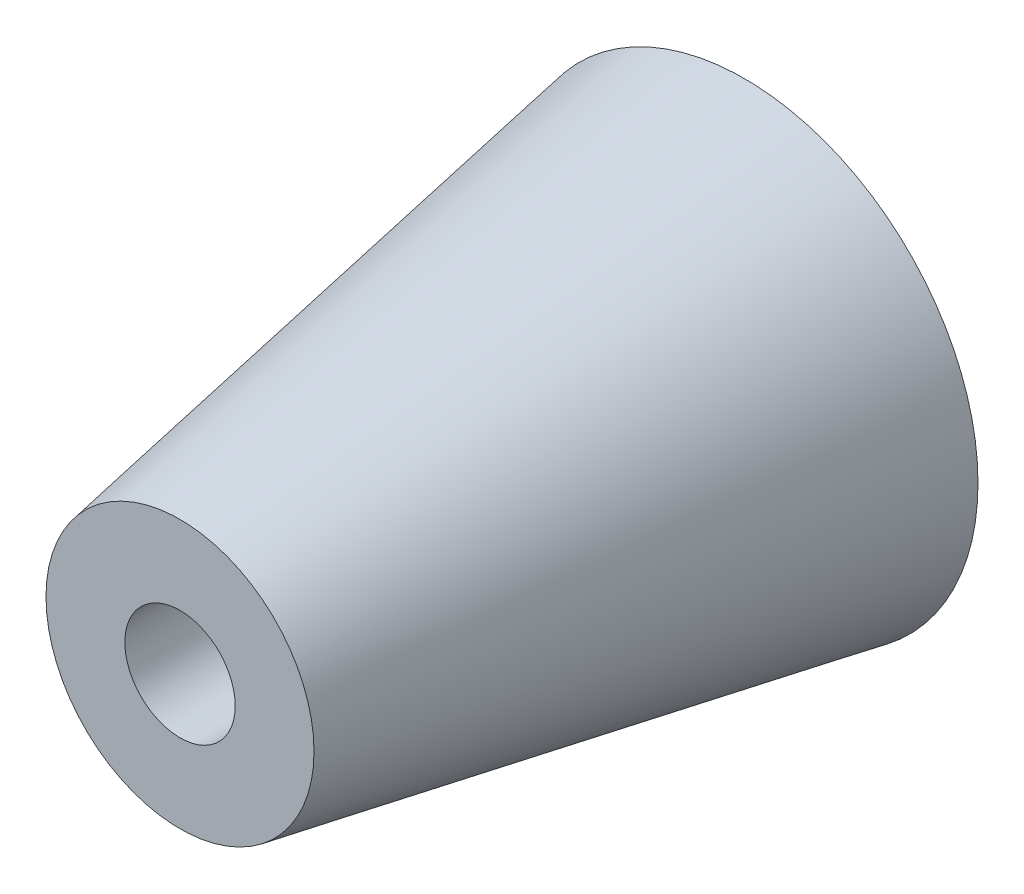
ISO-10303-21;
HEADER;
FILE_DESCRIPTION(('STEP AP214'),'2;1');
FILE_NAME('part.step','',(''),(''),'','','');
FILE_SCHEMA(('AUTOMOTIVE_DESIGN { 1 0 10303 214 1 1 1 1 }'));
ENDSEC;
DATA;
#1=APPLICATION_CONTEXT('core data for automotive mechanical design processes');
#2=APPLICATION_PROTOCOL_DEFINITION('international standard','automotive_design',2000,#1);
#3=PRODUCT_CONTEXT('',#1,'mechanical');
#4=PRODUCT('Part','Part','',(#3));
#5=PRODUCT_RELATED_PRODUCT_CATEGORY('part','',(#4));
#6=PRODUCT_DEFINITION_FORMATION('','',#4);
#7=PRODUCT_DEFINITION_CONTEXT('part definition',#1,'design');
#8=PRODUCT_DEFINITION('design','',#6,#7);
#9=PRODUCT_DEFINITION_SHAPE('','',#8);
#10=(LENGTH_UNIT() NAMED_UNIT(*) SI_UNIT(.MILLI.,.METRE.));
#11=(NAMED_UNIT(*) PLANE_ANGLE_UNIT() SI_UNIT($,.RADIAN.));
#12=(NAMED_UNIT(*) SI_UNIT($,.STERADIAN.) SOLID_ANGLE_UNIT());
#13=UNCERTAINTY_MEASURE_WITH_UNIT(LENGTH_MEASURE(1.E-05),#10,'distance_accuracy_value','');
#14=(GEOMETRIC_REPRESENTATION_CONTEXT(3) GLOBAL_UNCERTAINTY_ASSIGNED_CONTEXT((#13)) GLOBAL_UNIT_ASSIGNED_CONTEXT((#10,
#11,#12)) REPRESENTATION_CONTEXT('',''));
#15=CARTESIAN_POINT('',(0.,0.,0.));
#16=DIRECTION('',(0.,0.,1.));
#17=DIRECTION('',(1.,0.,0.));
#18=AXIS2_PLACEMENT_3D('',#15,#16,#17);
#19=CARTESIAN_POINT('',(0.,8.5,33.7153604632454));
#20=DIRECTION('',(0.,0.,-1.));
#21=DIRECTION('',(-1.,0.,0.));
#22=AXIS2_PLACEMENT_3D('',#19,#20,#21);
#23=PLANE('',#22);
#24=CARTESIAN_POINT('',(0.,0.,33.7153604632454));
#25=DIRECTION('',(0.,0.,1.));
#26=DIRECTION('',(1.,0.,0.));
#27=AXIS2_PLACEMENT_3D('',#24,#25,#26);
#28=CIRCLE('',#27,3.5);
#29=CARTESIAN_POINT('',(3.5,0.,33.7153604632454));
#30=VERTEX_POINT('',#29);
#31=EDGE_CURVE('E10',#30,#30,#28,.T.);
#32=ORIENTED_EDGE('',*,*,#31,.F.);
#33=EDGE_LOOP('',(#32));
#34=FACE_BOUND('',#33,.T.);
#35=CARTESIAN_POINT('',(0.,0.,33.7153604632454));
#36=DIRECTION('',(0.,0.,1.));
#37=DIRECTION('',(1.,0.,0.));
#38=AXIS2_PLACEMENT_3D('',#35,#36,#37);
#39=CIRCLE('',#38,8.5);
#40=CARTESIAN_POINT('',(8.5,0.,33.7153604632454));
#41=VERTEX_POINT('',#40);
#42=EDGE_CURVE('E50',#41,#41,#39,.T.);
#43=ORIENTED_EDGE('',*,*,#42,.T.);
#44=EDGE_LOOP('',(#43));
#45=FACE_BOUND('',#44,.T.);
#46=ADVANCED_FACE('F31',(#34,#45),#23,.F.);
#47=CARTESIAN_POINT('',(0.,0.,51.4954979569622));
#48=DIRECTION('',(0.,0.,1.));
#49=DIRECTION('',(1.,0.,0.));
#50=AXIS2_PLACEMENT_3D('',#47,#48,#49);
#51=CYLINDRICAL_SURFACE('',#50,3.5);
#52=CARTESIAN_POINT('',(0.,0.,28.7153604632454));
#53=DIRECTION('',(0.,0.,1.));
#54=DIRECTION('',(1.,0.,0.));
#55=AXIS2_PLACEMENT_3D('',#52,#53,#54);
#56=CIRCLE('',#55,3.5);
#57=CARTESIAN_POINT('',(3.5,0.,28.7153604632454));
#58=VERTEX_POINT('',#57);
#59=EDGE_CURVE('E37',#58,#58,#56,.T.);
#60=ORIENTED_EDGE('',*,*,#59,.F.);
#61=EDGE_LOOP('',(#60));
#62=FACE_BOUND('',#61,.T.);
#63=ORIENTED_EDGE('',*,*,#31,.T.);
#64=EDGE_LOOP('',(#63));
#65=FACE_BOUND('',#64,.T.);
#66=ADVANCED_FACE('F69',(#62,#65),#51,.F.);
#67=CARTESIAN_POINT('',(0.,0.,28.7153604632454));
#68=DIRECTION('',(0.,0.,-1.));
#69=DIRECTION('',(-1.,0.,0.));
#70=AXIS2_PLACEMENT_3D('',#67,#68,#69);
#71=CONICAL_SURFACE('',#70,3.5,0.191237378027495);
#72=CARTESIAN_POINT('',(0.,0.,-2.08463953675458));
#73=DIRECTION('',(0.,0.,1.));
#74=DIRECTION('',(1.,0.,0.));
#75=AXIS2_PLACEMENT_3D('',#72,#73,#74);
#76=CIRCLE('',#75,9.4629812847463);
#77=CARTESIAN_POINT('',(9.4629812847463,0.,-2.08463953675458));
#78=VERTEX_POINT('',#77);
#79=EDGE_CURVE('E41',#78,#78,#76,.T.);
#80=ORIENTED_EDGE('',*,*,#79,.F.);
#81=EDGE_LOOP('',(#80));
#82=FACE_BOUND('',#81,.T.);
#83=ORIENTED_EDGE('',*,*,#59,.T.);
#84=EDGE_LOOP('',(#83));
#85=FACE_BOUND('',#84,.T.);
#86=ADVANCED_FACE('F64',(#82,#85),#71,.F.);
#87=CARTESIAN_POINT('',(0.,9.4629812847463,-2.08463953675458));
#88=DIRECTION('',(0.,0.,1.));
#89=DIRECTION('',(1.,0.,0.));
#90=AXIS2_PLACEMENT_3D('',#87,#88,#89);
#91=PLANE('',#90);
#92=CARTESIAN_POINT('',(0.,0.,-2.08463953675458));
#93=DIRECTION('',(0.,0.,1.));
#94=DIRECTION('',(1.,0.,0.));
#95=AXIS2_PLACEMENT_3D('',#92,#93,#94);
#96=CIRCLE('',#95,14.8125059093631);
#97=CARTESIAN_POINT('',(14.8125059093631,0.,-2.08463953675458));
#98=VERTEX_POINT('',#97);
#99=EDGE_CURVE('E45',#98,#98,#96,.T.);
#100=ORIENTED_EDGE('',*,*,#99,.F.);
#101=EDGE_LOOP('',(#100));
#102=FACE_BOUND('',#101,.T.);
#103=ORIENTED_EDGE('',*,*,#79,.T.);
#104=EDGE_LOOP('',(#103));
#105=FACE_BOUND('',#104,.T.);
#106=ADVANCED_FACE('F58',(#102,#105),#91,.F.);
#107=CARTESIAN_POINT('',(0.,0.,-2.08463953675458));
#108=DIRECTION('',(0.,0.,-1.));
#109=DIRECTION('',(-1.,0.,0.));
#110=AXIS2_PLACEMENT_3D('',#107,#108,#109);
#111=CONICAL_SURFACE('',#110,14.8125059093631,0.174532925199434);
#112=ORIENTED_EDGE('',*,*,#42,.F.);
#113=EDGE_LOOP('',(#112));
#114=FACE_BOUND('',#113,.T.);
#115=ORIENTED_EDGE('',*,*,#99,.T.);
#116=EDGE_LOOP('',(#115));
#117=FACE_BOUND('',#116,.T.);
#118=ADVANCED_FACE('F55',(#114,#117),#111,.T.);
#119=CLOSED_SHELL('',(#46,#66,#86,#106,#118));
#120=MANIFOLD_SOLID_BREP('B2',#119);
#121=ADVANCED_BREP_SHAPE_REPRESENTATION('',(#18,#120),#14);
#122=SHAPE_DEFINITION_REPRESENTATION(#9,#121);
ENDSEC;
END-ISO-10303-21;
